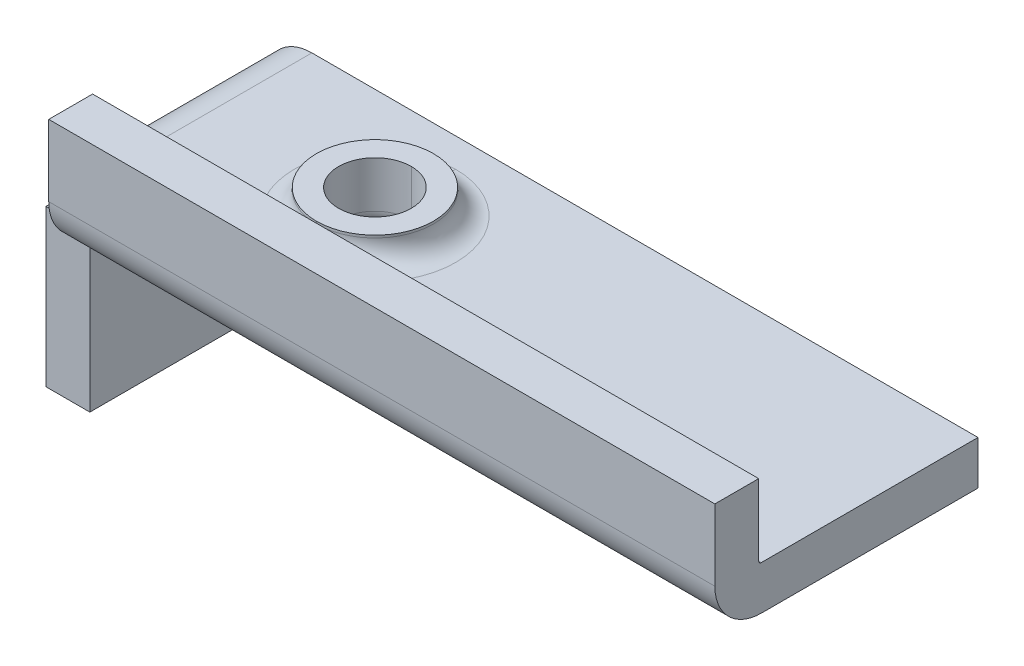
ISO-10303-21;
HEADER;
FILE_DESCRIPTION(('STEP AP214'),'2;1');
FILE_NAME('part.step','',(''),(''),'','','');
FILE_SCHEMA(('AUTOMOTIVE_DESIGN { 1 0 10303 214 1 1 1 1 }'));
ENDSEC;
DATA;
#1=APPLICATION_CONTEXT('core data for automotive mechanical design processes');
#2=APPLICATION_PROTOCOL_DEFINITION('international standard','automotive_design',2000,#1);
#3=PRODUCT_CONTEXT('',#1,'mechanical');
#4=PRODUCT('Part','Part','',(#3));
#5=PRODUCT_RELATED_PRODUCT_CATEGORY('part','',(#4));
#6=PRODUCT_DEFINITION_FORMATION('','',#4);
#7=PRODUCT_DEFINITION_CONTEXT('part definition',#1,'design');
#8=PRODUCT_DEFINITION('design','',#6,#7);
#9=PRODUCT_DEFINITION_SHAPE('','',#8);
#10=(LENGTH_UNIT() NAMED_UNIT(*) SI_UNIT(.MILLI.,.METRE.));
#11=(NAMED_UNIT(*) PLANE_ANGLE_UNIT() SI_UNIT($,.RADIAN.));
#12=(NAMED_UNIT(*) SI_UNIT($,.STERADIAN.) SOLID_ANGLE_UNIT());
#13=UNCERTAINTY_MEASURE_WITH_UNIT(LENGTH_MEASURE(1.E-05),#10,'distance_accuracy_value','');
#14=(GEOMETRIC_REPRESENTATION_CONTEXT(3) GLOBAL_UNCERTAINTY_ASSIGNED_CONTEXT((#13)) GLOBAL_UNIT_ASSIGNED_CONTEXT((#10,
#11,#12)) REPRESENTATION_CONTEXT('',''));
#15=CARTESIAN_POINT('',(0.,0.,0.));
#16=DIRECTION('',(0.,0.,1.));
#17=DIRECTION('',(1.,0.,0.));
#18=AXIS2_PLACEMENT_3D('',#15,#16,#17);
#19=CARTESIAN_POINT('',(-244.16652593928,215.2345812999,10.99999992174));
#20=DIRECTION('',(0.,1.,0.));
#21=DIRECTION('',(0.,0.,1.));
#22=AXIS2_PLACEMENT_3D('',#19,#20,#21);
#23=TOROIDAL_SURFACE('',#22,2.135,0.81);
#24=CARTESIAN_POINT('',(-244.16652593928,215.2345812999,10.99999992174));
#25=DIRECTION('',(0.,1.,0.));
#26=DIRECTION('',(0.,0.,1.));
#27=AXIS2_PLACEMENT_3D('',#24,#25,#26);
#28=CIRCLE('',#27,1.325);
#29=CARTESIAN_POINT('',(-244.16652593928,215.2345812999,12.32499992174));
#30=VERTEX_POINT('',#29);
#31=CARTESIAN_POINT('',(-244.16652593928,215.2345812999,9.67499992174));
#32=VERTEX_POINT('',#31);
#33=EDGE_CURVE('E11',#30,#32,#28,.T.);
#34=ORIENTED_EDGE('',*,*,#33,.T.);
#35=CARTESIAN_POINT('',(-244.16652593928,215.2345812999,8.86499992174));
#36=DIRECTION('',(1.,0.,0.));
#37=DIRECTION('',(0.,0.,1.));
#38=AXIS2_PLACEMENT_3D('',#35,#36,#37);
#39=CIRCLE('',#38,0.81);
#40=CARTESIAN_POINT('',(-244.16652593928,214.4245812999,8.86499992174));
#41=VERTEX_POINT('',#40);
#42=EDGE_CURVE('E416',#32,#41,#39,.T.);
#43=ORIENTED_EDGE('',*,*,#42,.T.);
#44=CARTESIAN_POINT('',(-244.16652593928,214.4245812999,10.99999992174));
#45=DIRECTION('',(0.,1.,0.));
#46=DIRECTION('',(0.,0.,1.));
#47=AXIS2_PLACEMENT_3D('',#44,#45,#46);
#48=CIRCLE('',#47,2.135);
#49=CARTESIAN_POINT('',(-244.16652593928,214.4245812999,13.13499992174));
#50=VERTEX_POINT('',#49);
#51=EDGE_CURVE('E405',#50,#41,#48,.T.);
#52=ORIENTED_EDGE('',*,*,#51,.F.);
#53=CARTESIAN_POINT('',(-244.16652593928,215.2345812999,13.13499992174));
#54=DIRECTION('',(-1.,0.,0.));
#55=DIRECTION('',(0.,0.,-1.));
#56=AXIS2_PLACEMENT_3D('',#53,#54,#55);
#57=CIRCLE('',#56,0.81);
#58=EDGE_CURVE('E413',#30,#50,#57,.T.);
#59=ORIENTED_EDGE('',*,*,#58,.F.);
#60=EDGE_LOOP('',(#34,#43,#52,#59));
#61=FACE_BOUND('',#60,.T.);
#62=ADVANCED_FACE('F16',(#61),#23,.T.);
#63=CARTESIAN_POINT('',(-244.16652593928,216.0795812999,10.99999992174));
#64=DIRECTION('',(0.,-1.,0.));
#65=DIRECTION('',(0.,0.,1.));
#66=AXIS2_PLACEMENT_3D('',#63,#64,#65);
#67=CYLINDRICAL_SURFACE('',#66,1.325);
#68=CARTESIAN_POINT('',(-244.16652593928,216.9245812999,10.99999992174));
#69=DIRECTION('',(0.,-1.,0.));
#70=DIRECTION('',(0.,0.,-1.));
#71=AXIS2_PLACEMENT_3D('',#68,#69,#70);
#72=CIRCLE('',#71,1.325);
#73=CARTESIAN_POINT('',(-244.16652593928,216.9245812999,9.67499992174));
#74=VERTEX_POINT('',#73);
#75=CARTESIAN_POINT('',(-244.16652593928,216.9245812999,12.32499992174));
#76=VERTEX_POINT('',#75);
#77=EDGE_CURVE('E163',#74,#76,#72,.T.);
#78=ORIENTED_EDGE('',*,*,#77,.F.);
#79=DIRECTION('',(0.,1.,0.));
#80=VECTOR('',#79,1.);
#81=CARTESIAN_POINT('',(-244.16652593928,215.2345812999,9.67499992174));
#82=LINE('',#81,#80);
#83=EDGE_CURVE('E174',#32,#74,#82,.T.);
#84=ORIENTED_EDGE('',*,*,#83,.F.);
#85=ORIENTED_EDGE('',*,*,#33,.F.);
#86=DIRECTION('',(0.,1.,0.));
#87=VECTOR('',#86,1.);
#88=CARTESIAN_POINT('',(-244.16652593928,215.2345812999,12.32499992174));
#89=LINE('',#88,#87);
#90=EDGE_CURVE('E423',#30,#76,#89,.T.);
#91=ORIENTED_EDGE('',*,*,#90,.T.);
#92=EDGE_LOOP('',(#78,#84,#85,#91));
#93=FACE_BOUND('',#92,.T.);
#94=ADVANCED_FACE('F438',(#93),#67,.F.);
#95=CARTESIAN_POINT('',(-244.16652593928,216.8795812999,10.99999992174));
#96=DIRECTION('',(0.,-1.,0.));
#97=DIRECTION('',(0.,0.,1.));
#98=AXIS2_PLACEMENT_3D('',#95,#96,#97);
#99=CYLINDRICAL_SURFACE('',#98,2.135);
#100=CARTESIAN_POINT('',(-244.16652593928,216.8345812999,10.99999992174));
#101=DIRECTION('',(0.,-1.,0.));
#102=DIRECTION('',(0.,0.,-1.));
#103=AXIS2_PLACEMENT_3D('',#100,#101,#102);
#104=CIRCLE('',#103,2.135);
#105=CARTESIAN_POINT('',(-244.16652593928,216.8345812999,8.86499992174));
#106=VERTEX_POINT('',#105);
#107=CARTESIAN_POINT('',(-244.16652593928,216.8345812999,13.13499992174));
#108=VERTEX_POINT('',#107);
#109=EDGE_CURVE('E26',#106,#108,#104,.T.);
#110=ORIENTED_EDGE('',*,*,#109,.F.);
#111=DIRECTION('',(0.,1.,0.));
#112=VECTOR('',#111,1.);
#113=CARTESIAN_POINT('',(-244.16652593928,216.8345812999,8.86499992174));
#114=LINE('',#113,#112);
#115=CARTESIAN_POINT('',(-244.16652593928,216.9245812999,8.86499992174));
#116=VERTEX_POINT('',#115);
#117=EDGE_CURVE('E147',#106,#116,#114,.T.);
#118=ORIENTED_EDGE('',*,*,#117,.T.);
#119=CARTESIAN_POINT('',(-244.16652593928,216.9245812999,10.99999992174));
#120=DIRECTION('',(0.,1.,0.));
#121=DIRECTION('',(0.,0.,1.));
#122=AXIS2_PLACEMENT_3D('',#119,#120,#121);
#123=CIRCLE('',#122,2.135);
#124=CARTESIAN_POINT('',(-244.16652593928,216.9245812999,13.13499992174));
#125=VERTEX_POINT('',#124);
#126=EDGE_CURVE('E151',#125,#116,#123,.T.);
#127=ORIENTED_EDGE('',*,*,#126,.F.);
#128=DIRECTION('',(0.,1.,0.));
#129=VECTOR('',#128,1.);
#130=CARTESIAN_POINT('',(-244.16652593928,216.8345812999,13.13499992174));
#131=LINE('',#130,#129);
#132=EDGE_CURVE('E156',#108,#125,#131,.T.);
#133=ORIENTED_EDGE('',*,*,#132,.F.);
#134=EDGE_LOOP('',(#110,#118,#127,#133));
#135=FACE_BOUND('',#134,.T.);
#136=ADVANCED_FACE('F149',(#135),#99,.T.);
#137=CARTESIAN_POINT('',(-244.16652593928,216.8345812999,10.99999992174));
#138=DIRECTION('',(0.,1.,0.));
#139=DIRECTION('',(0.,0.,1.));
#140=AXIS2_PLACEMENT_3D('',#137,#138,#139);
#141=TOROIDAL_SURFACE('',#140,2.945,0.81);
#142=CARTESIAN_POINT('',(-244.16652593928,216.0245812999,10.99999992174));
#143=DIRECTION('',(0.,-1.,0.));
#144=DIRECTION('',(0.,0.,-1.));
#145=AXIS2_PLACEMENT_3D('',#142,#143,#144);
#146=CIRCLE('',#145,2.945);
#147=CARTESIAN_POINT('',(-244.16652593928,216.0245812999,8.05499992174));
#148=VERTEX_POINT('',#147);
#149=CARTESIAN_POINT('',(-244.16652593928,216.0245812999,13.94499992174));
#150=VERTEX_POINT('',#149);
#151=EDGE_CURVE('E340',#148,#150,#146,.T.);
#152=ORIENTED_EDGE('',*,*,#151,.F.);
#153=CARTESIAN_POINT('',(-244.16652593928,216.8345812999,8.05499992174));
#154=DIRECTION('',(1.,0.,0.));
#155=DIRECTION('',(0.,0.,1.));
#156=AXIS2_PLACEMENT_3D('',#153,#154,#155);
#157=CIRCLE('',#156,0.81);
#158=EDGE_CURVE('E399',#106,#148,#157,.T.);
#159=ORIENTED_EDGE('',*,*,#158,.F.);
#160=ORIENTED_EDGE('',*,*,#109,.T.);
#161=CARTESIAN_POINT('',(-244.16652593928,216.8345812999,13.94499992174));
#162=DIRECTION('',(-1.,0.,0.));
#163=DIRECTION('',(0.,0.,-1.));
#164=AXIS2_PLACEMENT_3D('',#161,#162,#163);
#165=CIRCLE('',#164,0.81);
#166=EDGE_CURVE('E185',#108,#150,#165,.T.);
#167=ORIENTED_EDGE('',*,*,#166,.T.);
#168=EDGE_LOOP('',(#152,#159,#160,#167));
#169=FACE_BOUND('',#168,.T.);
#170=ADVANCED_FACE('F749',(#169),#141,.F.);
#171=CARTESIAN_POINT('',(-244.16652593928,216.8345812999,10.99999992174));
#172=DIRECTION('',(0.,1.,0.));
#173=DIRECTION('',(0.,0.,1.));
#174=AXIS2_PLACEMENT_3D('',#171,#172,#173);
#175=TOROIDAL_SURFACE('',#174,2.945,0.81);
#176=ORIENTED_EDGE('',*,*,#166,.F.);
#177=CARTESIAN_POINT('',(-244.16652593928,216.8345812999,10.99999992174));
#178=DIRECTION('',(0.,-1.,0.));
#179=DIRECTION('',(0.,0.,1.));
#180=AXIS2_PLACEMENT_3D('',#177,#178,#179);
#181=CIRCLE('',#180,2.135);
#182=EDGE_CURVE('E155',#108,#106,#181,.T.);
#183=ORIENTED_EDGE('',*,*,#182,.T.);
#184=ORIENTED_EDGE('',*,*,#158,.T.);
#185=CARTESIAN_POINT('',(-244.16652593928,216.0245812999,10.99999992174));
#186=DIRECTION('',(0.,-1.,0.));
#187=DIRECTION('',(0.,0.,1.));
#188=AXIS2_PLACEMENT_3D('',#185,#186,#187);
#189=CIRCLE('',#188,2.945);
#190=EDGE_CURVE('E344',#150,#148,#189,.T.);
#191=ORIENTED_EDGE('',*,*,#190,.F.);
#192=EDGE_LOOP('',(#176,#183,#184,#191));
#193=FACE_BOUND('',#192,.T.);
#194=ADVANCED_FACE('F449',(#193),#175,.F.);
#195=CARTESIAN_POINT('',(-244.16652593928,216.8795812999,10.99999992174));
#196=DIRECTION('',(0.,-1.,0.));
#197=DIRECTION('',(0.,0.,1.));
#198=AXIS2_PLACEMENT_3D('',#195,#196,#197);
#199=CYLINDRICAL_SURFACE('',#198,2.135);
#200=ORIENTED_EDGE('',*,*,#132,.T.);
#201=CARTESIAN_POINT('',(-244.16652593928,216.9245812999,10.99999992174));
#202=DIRECTION('',(0.,1.,0.));
#203=DIRECTION('',(0.,0.,-1.));
#204=AXIS2_PLACEMENT_3D('',#201,#202,#203);
#205=CIRCLE('',#204,2.135);
#206=EDGE_CURVE('E159',#116,#125,#205,.T.);
#207=ORIENTED_EDGE('',*,*,#206,.F.);
#208=ORIENTED_EDGE('',*,*,#117,.F.);
#209=ORIENTED_EDGE('',*,*,#182,.F.);
#210=EDGE_LOOP('',(#200,#207,#208,#209));
#211=FACE_BOUND('',#210,.T.);
#212=ADVANCED_FACE('F160',(#211),#199,.T.);
#213=CARTESIAN_POINT('',(-244.16652593928,216.9245812999,12.72999992174));
#214=DIRECTION('',(0.,-1.,0.));
#215=DIRECTION('',(1.,0.,0.));
#216=AXIS2_PLACEMENT_3D('',#213,#214,#215);
#217=PLANE('',#216);
#218=ORIENTED_EDGE('',*,*,#77,.T.);
#219=CARTESIAN_POINT('',(-244.16652593928,216.9245812999,10.99999992174));
#220=DIRECTION('',(0.,-1.,0.));
#221=DIRECTION('',(0.,0.,1.));
#222=AXIS2_PLACEMENT_3D('',#219,#220,#221);
#223=CIRCLE('',#222,1.325);
#224=EDGE_CURVE('E167',#76,#74,#223,.T.);
#225=ORIENTED_EDGE('',*,*,#224,.T.);
#226=EDGE_LOOP('',(#218,#225));
#227=FACE_BOUND('',#226,.T.);
#228=ORIENTED_EDGE('',*,*,#126,.T.);
#229=ORIENTED_EDGE('',*,*,#206,.T.);
#230=EDGE_LOOP('',(#228,#229));
#231=FACE_BOUND('',#230,.T.);
#232=ADVANCED_FACE('F165',(#227,#231),#217,.F.);
#233=CARTESIAN_POINT('',(-244.16652593928,216.0795812999,10.99999992174));
#234=DIRECTION('',(0.,-1.,0.));
#235=DIRECTION('',(0.,0.,1.));
#236=AXIS2_PLACEMENT_3D('',#233,#234,#235);
#237=CYLINDRICAL_SURFACE('',#236,1.325);
#238=ORIENTED_EDGE('',*,*,#90,.F.);
#239=CARTESIAN_POINT('',(-244.16652593928,215.2345812999,10.99999992174));
#240=DIRECTION('',(0.,1.,0.));
#241=DIRECTION('',(0.,0.,-1.));
#242=AXIS2_PLACEMENT_3D('',#239,#240,#241);
#243=CIRCLE('',#242,1.325);
#244=EDGE_CURVE('E419',#32,#30,#243,.T.);
#245=ORIENTED_EDGE('',*,*,#244,.F.);
#246=ORIENTED_EDGE('',*,*,#83,.T.);
#247=ORIENTED_EDGE('',*,*,#224,.F.);
#248=EDGE_LOOP('',(#238,#245,#246,#247));
#249=FACE_BOUND('',#248,.T.);
#250=ADVANCED_FACE('F435',(#249),#237,.F.);
#251=CARTESIAN_POINT('',(-244.16652593928,215.2345812999,10.99999992174));
#252=DIRECTION('',(0.,1.,0.));
#253=DIRECTION('',(0.,0.,1.));
#254=AXIS2_PLACEMENT_3D('',#251,#252,#253);
#255=TOROIDAL_SURFACE('',#254,2.135,0.81);
#256=ORIENTED_EDGE('',*,*,#58,.T.);
#257=CARTESIAN_POINT('',(-244.16652593928,214.4245812999,10.99999992174));
#258=DIRECTION('',(0.,1.,0.));
#259=DIRECTION('',(0.,0.,-1.));
#260=AXIS2_PLACEMENT_3D('',#257,#258,#259);
#261=CIRCLE('',#260,2.135);
#262=EDGE_CURVE('E409',#41,#50,#261,.T.);
#263=ORIENTED_EDGE('',*,*,#262,.F.);
#264=ORIENTED_EDGE('',*,*,#42,.F.);
#265=ORIENTED_EDGE('',*,*,#244,.T.);
#266=EDGE_LOOP('',(#256,#263,#264,#265));
#267=FACE_BOUND('',#266,.T.);
#268=ADVANCED_FACE('F447',(#267),#255,.T.);
#269=CARTESIAN_POINT('',(-250.46652593928,214.4245812999,14.99999992174));
#270=DIRECTION('',(0.,-1.,0.));
#271=DIRECTION('',(1.,0.,0.));
#272=AXIS2_PLACEMENT_3D('',#269,#270,#271);
#273=PLANE('',#272);
#274=ORIENTED_EDGE('',*,*,#51,.T.);
#275=ORIENTED_EDGE('',*,*,#262,.T.);
#276=EDGE_LOOP('',(#274,#275));
#277=FACE_BOUND('',#276,.T.);
#278=DIRECTION('',(0.,0.,1.));
#279=VECTOR('',#278,1.);
#280=CARTESIAN_POINT('',(-250.46652593928,214.4245812999,6.99999992174));
#281=LINE('',#280,#279);
#282=CARTESIAN_POINT('',(-250.46652593928,214.4245812999,6.99999992174));
#283=VERTEX_POINT('',#282);
#284=CARTESIAN_POINT('',(-250.46652593928,214.4245812999,14.89999992174));
#285=VERTEX_POINT('',#284);
#286=EDGE_CURVE('E469',#283,#285,#281,.T.);
#287=ORIENTED_EDGE('',*,*,#286,.F.);
#288=DIRECTION('',(1.,0.,0.));
#289=VECTOR('',#288,1.);
#290=CARTESIAN_POINT('',(-250.46652593928,214.4245812999,6.99999992174));
#291=LINE('',#290,#289);
#292=CARTESIAN_POINT('',(-226.16652593928,214.4245812999,6.99999992174));
#293=VERTEX_POINT('',#292);
#294=EDGE_CURVE('E326',#283,#293,#291,.T.);
#295=ORIENTED_EDGE('',*,*,#294,.T.);
#296=DIRECTION('',(0.,0.,-1.));
#297=VECTOR('',#296,1.);
#298=CARTESIAN_POINT('',(-226.16652593928,214.4245812999,14.89999992174));
#299=LINE('',#298,#297);
#300=CARTESIAN_POINT('',(-226.16652593928,214.4245812999,14.89999992174));
#301=VERTEX_POINT('',#300);
#302=EDGE_CURVE('E404',#301,#293,#299,.T.);
#303=ORIENTED_EDGE('',*,*,#302,.F.);
#304=DIRECTION('',(1.,0.,0.));
#305=VECTOR('',#304,1.);
#306=CARTESIAN_POINT('',(-250.46652593928,214.4245812999,14.89999992174));
#307=LINE('',#306,#305);
#308=EDGE_CURVE('E390',#285,#301,#307,.T.);
#309=ORIENTED_EDGE('',*,*,#308,.F.);
#310=EDGE_LOOP('',(#287,#295,#303,#309));
#311=FACE_BOUND('',#310,.T.);
#312=ADVANCED_FACE('F461',(#277,#311),#273,.T.);
#313=CARTESIAN_POINT('',(-226.16652593928,214.4245812999,14.99999992174));
#314=DIRECTION('',(1.,0.,0.));
#315=DIRECTION('',(0.,-1.,0.));
#316=AXIS2_PLACEMENT_3D('',#313,#314,#315);
#317=PLANE('',#316);
#318=DIRECTION('',(0.,-1.,0.));
#319=VECTOR('',#318,1.);
#320=CARTESIAN_POINT('',(-226.16652593928,216.0245812999,6.99999992174));
#321=LINE('',#320,#319);
#322=CARTESIAN_POINT('',(-226.16652593928,216.0245812999,6.99999992174));
#323=VERTEX_POINT('',#322);
#324=EDGE_CURVE('E322',#323,#293,#321,.T.);
#325=ORIENTED_EDGE('',*,*,#324,.F.);
#326=DIRECTION('',(0.,0.,-1.));
#327=VECTOR('',#326,1.);
#328=CARTESIAN_POINT('',(-226.16652593928,216.0245812999,14.89999992174));
#329=LINE('',#328,#327);
#330=CARTESIAN_POINT('',(-226.16652593928,216.0245812999,14.89999992174));
#331=VERTEX_POINT('',#330);
#332=EDGE_CURVE('E333',#331,#323,#329,.T.);
#333=ORIENTED_EDGE('',*,*,#332,.F.);
#334=CARTESIAN_POINT('',(-226.16652593928,216.1245812999,14.89999992174));
#335=DIRECTION('',(-1.,0.,0.));
#336=DIRECTION('',(0.,-1.,-7.460698725481E-13));
#337=AXIS2_PLACEMENT_3D('',#334,#335,#336);
#338=CIRCLE('',#337,0.1);
#339=CARTESIAN_POINT('',(-226.16652593928,216.1245812999,14.99999992174));
#340=VERTEX_POINT('',#339);
#341=EDGE_CURVE('E348',#331,#340,#338,.T.);
#342=ORIENTED_EDGE('',*,*,#341,.T.);
#343=DIRECTION('',(0.,-1.,0.));
#344=VECTOR('',#343,1.);
#345=CARTESIAN_POINT('',(-226.16652593928,218.7245812999,14.99999992174));
#346=LINE('',#345,#344);
#347=CARTESIAN_POINT('',(-226.16652593928,218.7245812999,14.99999992174));
#348=VERTEX_POINT('',#347);
#349=EDGE_CURVE('E359',#348,#340,#346,.T.);
#350=ORIENTED_EDGE('',*,*,#349,.F.);
#351=DIRECTION('',(0.,0.,1.));
#352=VECTOR('',#351,1.);
#353=CARTESIAN_POINT('',(-226.16652593928,218.7245812999,14.99999992174));
#354=LINE('',#353,#352);
#355=CARTESIAN_POINT('',(-226.16652593928,218.7245812999,16.59999992174));
#356=VERTEX_POINT('',#355);
#357=EDGE_CURVE('E370',#348,#356,#354,.T.);
#358=ORIENTED_EDGE('',*,*,#357,.T.);
#359=DIRECTION('',(0.,-1.,0.));
#360=VECTOR('',#359,1.);
#361=CARTESIAN_POINT('',(-226.16652593928,218.7245812999,16.59999992174));
#362=LINE('',#361,#360);
#363=CARTESIAN_POINT('',(-226.16652593928,216.1245812999,16.59999992174));
#364=VERTEX_POINT('',#363);
#365=EDGE_CURVE('E382',#356,#364,#362,.T.);
#366=ORIENTED_EDGE('',*,*,#365,.T.);
#367=CARTESIAN_POINT('',(-226.16652593928,216.1245812999,14.89999992174));
#368=DIRECTION('',(1.,0.,0.));
#369=DIRECTION('',(0.,-5.935121675173E-13,1.));
#370=AXIS2_PLACEMENT_3D('',#367,#368,#369);
#371=CIRCLE('',#370,1.7);
#372=EDGE_CURVE('E394',#364,#301,#371,.T.);
#373=ORIENTED_EDGE('',*,*,#372,.T.);
#374=ORIENTED_EDGE('',*,*,#302,.T.);
#375=EDGE_LOOP('',(#325,#333,#342,#350,#358,#366,#373,#374));
#376=FACE_BOUND('',#375,.T.);
#377=ADVANCED_FACE('F464',(#376),#317,.T.);
#378=CARTESIAN_POINT('',(-250.46652593928,216.1245812999,14.89999992174));
#379=DIRECTION('',(1.,0.,0.));
#380=DIRECTION('',(0.,-1.,0.));
#381=AXIS2_PLACEMENT_3D('',#378,#379,#380);
#382=PLANE('',#381);
#383=DIRECTION('',(0.,1.,0.));
#384=VECTOR('',#383,1.);
#385=CARTESIAN_POINT('',(-250.46652593928,216.1245812999,16.59999992174));
#386=LINE('',#385,#384);
#387=CARTESIAN_POINT('',(-250.46652593928,216.1245812999,16.59999992174));
#388=VERTEX_POINT('',#387);
#389=CARTESIAN_POINT('',(-250.46652593928,218.7245812999,16.59999992174));
#390=VERTEX_POINT('',#389);
#391=EDGE_CURVE('E383',#388,#390,#386,.T.);
#392=ORIENTED_EDGE('',*,*,#391,.T.);
#393=DIRECTION('',(0.,0.,1.));
#394=VECTOR('',#393,1.);
#395=CARTESIAN_POINT('',(-250.46652593928,218.7245812999,14.99999992174));
#396=LINE('',#395,#394);
#397=CARTESIAN_POINT('',(-250.46652593928,218.7245812999,14.99999992174));
#398=VERTEX_POINT('',#397);
#399=EDGE_CURVE('E374',#398,#390,#396,.T.);
#400=ORIENTED_EDGE('',*,*,#399,.F.);
#401=DIRECTION('',(0.,1.,0.));
#402=VECTOR('',#401,1.);
#403=CARTESIAN_POINT('',(-250.46652593928,216.1245812999,14.99999992174));
#404=LINE('',#403,#402);
#405=CARTESIAN_POINT('',(-250.46652593928,216.1245812999,14.99999992174));
#406=VERTEX_POINT('',#405);
#407=EDGE_CURVE('E362',#406,#398,#404,.T.);
#408=ORIENTED_EDGE('',*,*,#407,.F.);
#409=CARTESIAN_POINT('',(-250.46652593928,216.1245812999,14.89999992174));
#410=DIRECTION('',(1.,0.,0.));
#411=DIRECTION('',(0.,-1.136868377216E-12,1.));
#412=AXIS2_PLACEMENT_3D('',#409,#410,#411);
#413=CIRCLE('',#412,0.1);
#414=CARTESIAN_POINT('',(-250.46652593928,216.0245812999,14.89999992174));
#415=VERTEX_POINT('',#414);
#416=EDGE_CURVE('E352',#406,#415,#413,.T.);
#417=ORIENTED_EDGE('',*,*,#416,.T.);
#418=DIRECTION('',(0.,-1.,0.));
#419=VECTOR('',#418,1.);
#420=CARTESIAN_POINT('',(-250.46652593928,216.0245812999,14.89999992174));
#421=LINE('',#420,#419);
#422=EDGE_CURVE('E497',#415,#285,#421,.T.);
#423=ORIENTED_EDGE('',*,*,#422,.T.);
#424=CARTESIAN_POINT('',(-250.46652593928,216.1245812999,14.89999992174));
#425=DIRECTION('',(-1.,0.,0.));
#426=DIRECTION('',(0.,-1.,0.));
#427=AXIS2_PLACEMENT_3D('',#424,#425,#426);
#428=CIRCLE('',#427,1.7);
#429=EDGE_CURVE('E398',#285,#388,#428,.T.);
#430=ORIENTED_EDGE('',*,*,#429,.T.);
#431=EDGE_LOOP('',(#392,#400,#408,#417,#423,#430));
#432=FACE_BOUND('',#431,.T.);
#433=ADVANCED_FACE('F601',(#432),#382,.F.);
#434=CARTESIAN_POINT('',(-228.16652593928,216.1245812999,14.89999992174));
#435=DIRECTION('',(1.,0.,0.));
#436=DIRECTION('',(0.,-1.,0.));
#437=AXIS2_PLACEMENT_3D('',#434,#435,#436);
#438=CYLINDRICAL_SURFACE('',#437,1.7);
#439=ORIENTED_EDGE('',*,*,#308,.T.);
#440=ORIENTED_EDGE('',*,*,#372,.F.);
#441=DIRECTION('',(-1.,0.,0.));
#442=VECTOR('',#441,1.);
#443=CARTESIAN_POINT('',(-226.16652593928,216.1245812999,16.59999992174));
#444=LINE('',#443,#442);
#445=EDGE_CURVE('E386',#364,#388,#444,.T.);
#446=ORIENTED_EDGE('',*,*,#445,.T.);
#447=ORIENTED_EDGE('',*,*,#429,.F.);
#448=EDGE_LOOP('',(#439,#440,#446,#447));
#449=FACE_BOUND('',#448,.T.);
#450=ADVANCED_FACE('F597',(#449),#438,.T.);
#451=CARTESIAN_POINT('',(-250.46652593928,215.8790060993,16.59999992174));
#452=DIRECTION('',(0.,0.,1.));
#453=DIRECTION('',(0.,1.,0.));
#454=AXIS2_PLACEMENT_3D('',#451,#452,#453);
#455=PLANE('',#454);
#456=ORIENTED_EDGE('',*,*,#365,.F.);
#457=DIRECTION('',(-1.,0.,0.));
#458=VECTOR('',#457,1.);
#459=CARTESIAN_POINT('',(-226.16652593928,218.7245812999,16.59999992174));
#460=LINE('',#459,#458);
#461=EDGE_CURVE('E378',#356,#390,#460,.T.);
#462=ORIENTED_EDGE('',*,*,#461,.T.);
#463=ORIENTED_EDGE('',*,*,#391,.F.);
#464=ORIENTED_EDGE('',*,*,#445,.F.);
#465=EDGE_LOOP('',(#456,#462,#463,#464));
#466=FACE_BOUND('',#465,.T.);
#467=ADVANCED_FACE('F593',(#466),#455,.T.);
#468=CARTESIAN_POINT('',(-228.16652593928,218.7245812999,16.59999992174));
#469=DIRECTION('',(0.,1.,0.));
#470=DIRECTION('',(0.,0.,1.));
#471=AXIS2_PLACEMENT_3D('',#468,#469,#470);
#472=PLANE('',#471);
#473=ORIENTED_EDGE('',*,*,#357,.F.);
#474=DIRECTION('',(-1.,0.,0.));
#475=VECTOR('',#474,1.);
#476=CARTESIAN_POINT('',(-226.16652593928,218.7245812999,14.99999992174));
#477=LINE('',#476,#475);
#478=EDGE_CURVE('E366',#348,#398,#477,.T.);
#479=ORIENTED_EDGE('',*,*,#478,.T.);
#480=ORIENTED_EDGE('',*,*,#399,.T.);
#481=ORIENTED_EDGE('',*,*,#461,.F.);
#482=EDGE_LOOP('',(#473,#479,#480,#481));
#483=FACE_BOUND('',#482,.T.);
#484=ADVANCED_FACE('F579',(#483),#472,.T.);
#485=CARTESIAN_POINT('',(-250.46652593928,215.8790060993,14.99999992174));
#486=DIRECTION('',(0.,0.,1.));
#487=DIRECTION('',(0.,1.,0.));
#488=AXIS2_PLACEMENT_3D('',#485,#486,#487);
#489=PLANE('',#488);
#490=ORIENTED_EDGE('',*,*,#349,.T.);
#491=DIRECTION('',(1.,0.,0.));
#492=VECTOR('',#491,1.);
#493=CARTESIAN_POINT('',(-250.46652593928,216.1245812999,14.99999992174));
#494=LINE('',#493,#492);
#495=EDGE_CURVE('E355',#406,#340,#494,.T.);
#496=ORIENTED_EDGE('',*,*,#495,.F.);
#497=ORIENTED_EDGE('',*,*,#407,.T.);
#498=ORIENTED_EDGE('',*,*,#478,.F.);
#499=EDGE_LOOP('',(#490,#496,#497,#498));
#500=FACE_BOUND('',#499,.T.);
#501=ADVANCED_FACE('F577',(#500),#489,.F.);
#502=CARTESIAN_POINT('',(-228.16652593928,216.1245812999,14.89999992174));
#503=DIRECTION('',(1.,0.,0.));
#504=DIRECTION('',(0.,-1.,0.));
#505=AXIS2_PLACEMENT_3D('',#502,#503,#504);
#506=CYLINDRICAL_SURFACE('',#505,0.1);
#507=ORIENTED_EDGE('',*,*,#341,.F.);
#508=DIRECTION('',(-1.,0.,0.));
#509=VECTOR('',#508,1.);
#510=CARTESIAN_POINT('',(-226.16652593928,216.0245812999,14.89999992174));
#511=LINE('',#510,#509);
#512=EDGE_CURVE('E336',#331,#415,#511,.T.);
#513=ORIENTED_EDGE('',*,*,#512,.T.);
#514=ORIENTED_EDGE('',*,*,#416,.F.);
#515=ORIENTED_EDGE('',*,*,#495,.T.);
#516=EDGE_LOOP('',(#507,#513,#514,#515));
#517=FACE_BOUND('',#516,.T.);
#518=ADVANCED_FACE('F575',(#517),#506,.F.);
#519=CARTESIAN_POINT('',(-250.46652593928,216.0245812999,14.99999992174));
#520=DIRECTION('',(0.,-1.,0.));
#521=DIRECTION('',(1.,0.,0.));
#522=AXIS2_PLACEMENT_3D('',#519,#520,#521);
#523=PLANE('',#522);
#524=ORIENTED_EDGE('',*,*,#151,.T.);
#525=ORIENTED_EDGE('',*,*,#190,.T.);
#526=EDGE_LOOP('',(#524,#525));
#527=FACE_BOUND('',#526,.T.);
#528=ORIENTED_EDGE('',*,*,#332,.T.);
#529=DIRECTION('',(-1.,0.,0.));
#530=VECTOR('',#529,1.);
#531=CARTESIAN_POINT('',(-226.16652593928,216.0245812999,6.99999992174));
#532=LINE('',#531,#530);
#533=CARTESIAN_POINT('',(-250.46652593928,216.0245812999,6.99999992174));
#534=VERTEX_POINT('',#533);
#535=EDGE_CURVE('E330',#323,#534,#532,.T.);
#536=ORIENTED_EDGE('',*,*,#535,.T.);
#537=DIRECTION('',(0.,0.,-1.));
#538=VECTOR('',#537,1.);
#539=CARTESIAN_POINT('',(-250.46652593928,216.0245812999,14.89999992174));
#540=LINE('',#539,#538);
#541=EDGE_CURVE('E302',#415,#534,#540,.T.);
#542=ORIENTED_EDGE('',*,*,#541,.F.);
#543=ORIENTED_EDGE('',*,*,#512,.F.);
#544=EDGE_LOOP('',(#528,#536,#542,#543));
#545=FACE_BOUND('',#544,.T.);
#546=ADVANCED_FACE('F587',(#527,#545),#523,.F.);
#547=CARTESIAN_POINT('',(-256.77210353988,212.6245812999,6.99999992174));
#548=DIRECTION('',(0.,0.,1.));
#549=DIRECTION('',(0.,1.,0.));
#550=AXIS2_PLACEMENT_3D('',#547,#548,#549);
#551=PLANE('',#550);
#552=ORIENTED_EDGE('',*,*,#324,.T.);
#553=ORIENTED_EDGE('',*,*,#294,.F.);
#554=CARTESIAN_POINT('',(-250.46652593928,214.3245812999,6.99999992174));
#555=DIRECTION('',(0.,0.,1.));
#556=DIRECTION('',(7.105427357601E-13,1.,0.));
#557=AXIS2_PLACEMENT_3D('',#554,#555,#556);
#558=CIRCLE('',#557,0.1);
#559=CARTESIAN_POINT('',(-250.56652593928,214.3245812999,6.99999992174));
#560=VERTEX_POINT('',#559);
#561=EDGE_CURVE('E475',#283,#560,#558,.T.);
#562=ORIENTED_EDGE('',*,*,#561,.T.);
#563=DIRECTION('',(0.,1.,0.));
#564=VECTOR('',#563,1.);
#565=CARTESIAN_POINT('',(-250.56652593928,208.62458129992,6.99999992174));
#566=LINE('',#565,#564);
#567=CARTESIAN_POINT('',(-250.56652593928,208.62458129992,6.99999992174));
#568=VERTEX_POINT('',#567);
#569=EDGE_CURVE('E489',#568,#560,#566,.T.);
#570=ORIENTED_EDGE('',*,*,#569,.F.);
#571=DIRECTION('',(1.,0.,0.));
#572=VECTOR('',#571,1.);
#573=CARTESIAN_POINT('',(-252.16652593928,208.62458129992,6.99999992174));
#574=LINE('',#573,#572);
#575=CARTESIAN_POINT('',(-252.16652593928,208.62458129992,6.99999992174));
#576=VERTEX_POINT('',#575);
#577=EDGE_CURVE('E319',#576,#568,#574,.T.);
#578=ORIENTED_EDGE('',*,*,#577,.F.);
#579=DIRECTION('',(0.,-1.,0.));
#580=VECTOR('',#579,1.);
#581=CARTESIAN_POINT('',(-252.16652593928,214.3245812999,6.99999992174));
#582=LINE('',#581,#580);
#583=CARTESIAN_POINT('',(-252.16652593928,214.3245812999,6.99999992174));
#584=VERTEX_POINT('',#583);
#585=EDGE_CURVE('E273',#584,#576,#582,.T.);
#586=ORIENTED_EDGE('',*,*,#585,.F.);
#587=CARTESIAN_POINT('',(-250.46652593928,214.3245812999,6.99999992174));
#588=DIRECTION('',(0.,0.,-1.));
#589=DIRECTION('',(-1.,0.,0.));
#590=AXIS2_PLACEMENT_3D('',#587,#588,#589);
#591=CIRCLE('',#590,1.7);
#592=EDGE_CURVE('E296',#584,#534,#591,.T.);
#593=ORIENTED_EDGE('',*,*,#592,.T.);
#594=ORIENTED_EDGE('',*,*,#535,.F.);
#595=EDGE_LOOP('',(#552,#553,#562,#570,#578,#586,#593,#594));
#596=FACE_BOUND('',#595,.T.);
#597=ADVANCED_FACE('F584',(#596),#551,.F.);
#598=CARTESIAN_POINT('',(-251.28096956382,208.62458129992,10.275290952503));
#599=DIRECTION('',(0.,-1.,0.));
#600=DIRECTION('',(1.,0.,0.));
#601=AXIS2_PLACEMENT_3D('',#598,#599,#600);
#602=PLANE('',#601);
#603=DIRECTION('',(-1.,0.,0.));
#604=VECTOR('',#603,1.);
#605=CARTESIAN_POINT('',(-250.56652593928,208.62458129992,14.99999992174));
#606=LINE('',#605,#604);
#607=CARTESIAN_POINT('',(-250.56652593928,208.62458129992,14.99999992174));
#608=VERTEX_POINT('',#607);
#609=CARTESIAN_POINT('',(-252.16652593928,208.62458129992,14.99999992174));
#610=VERTEX_POINT('',#609);
#611=EDGE_CURVE('E555',#608,#610,#606,.T.);
#612=ORIENTED_EDGE('',*,*,#611,.T.);
#613=DIRECTION('',(0.,0.,-1.));
#614=VECTOR('',#613,1.);
#615=CARTESIAN_POINT('',(-252.16652593928,208.62458129992,14.99999992174));
#616=LINE('',#615,#614);
#617=EDGE_CURVE('E281',#610,#576,#616,.T.);
#618=ORIENTED_EDGE('',*,*,#617,.T.);
#619=ORIENTED_EDGE('',*,*,#577,.T.);
#620=DIRECTION('',(0.,0.,1.));
#621=VECTOR('',#620,1.);
#622=CARTESIAN_POINT('',(-250.56652593928,208.62458129992,6.99999992174));
#623=LINE('',#622,#621);
#624=EDGE_CURVE('E492',#568,#608,#623,.T.);
#625=ORIENTED_EDGE('',*,*,#624,.T.);
#626=EDGE_LOOP('',(#612,#618,#619,#625));
#627=FACE_BOUND('',#626,.T.);
#628=ADVANCED_FACE('F208',(#627),#602,.T.);
#629=CARTESIAN_POINT('',(-252.16652593928,209.42458129992,8.99999992174));
#630=DIRECTION('',(-1.,0.,0.));
#631=DIRECTION('',(0.,0.,-1.));
#632=AXIS2_PLACEMENT_3D('',#629,#630,#631);
#633=PLANE('',#632);
#634=ORIENTED_EDGE('',*,*,#585,.T.);
#635=ORIENTED_EDGE('',*,*,#617,.F.);
#636=DIRECTION('',(0.,-1.,0.));
#637=VECTOR('',#636,1.);
#638=CARTESIAN_POINT('',(-252.16652593928,214.3245812999,14.99999992174));
#639=LINE('',#638,#637);
#640=CARTESIAN_POINT('',(-252.16652593928,214.3245812999,14.99999992174));
#641=VERTEX_POINT('',#640);
#642=EDGE_CURVE('E516',#641,#610,#639,.T.);
#643=ORIENTED_EDGE('',*,*,#642,.F.);
#644=DIRECTION('',(-1.42108547152E-13,-1.42108547152E-13,1.));
#645=VECTOR('',#644,1.);
#646=CARTESIAN_POINT('',(-252.16652593928,214.3245812999,14.89999992174));
#647=LINE('',#646,#645);
#648=CARTESIAN_POINT('',(-252.16652593928,214.3245812999,14.89999992174));
#649=VERTEX_POINT('',#648);
#650=EDGE_CURVE('E512',#649,#641,#647,.T.);
#651=ORIENTED_EDGE('',*,*,#650,.F.);
#652=DIRECTION('',(0.,0.,1.));
#653=VECTOR('',#652,1.);
#654=CARTESIAN_POINT('',(-252.16652593928,214.3245812999,12.74999992174));
#655=LINE('',#654,#653);
#656=CARTESIAN_POINT('',(-252.16652593928,214.3245812999,12.74999992174));
#657=VERTEX_POINT('',#656);
#658=EDGE_CURVE('E271',#657,#649,#655,.T.);
#659=ORIENTED_EDGE('',*,*,#658,.F.);
#660=CARTESIAN_POINT('',(-252.16652593928,214.3245812999,12.74999992174));
#661=DIRECTION('',(0.,1.,0.));
#662=VECTOR('',#661,1.);
#663=LINE('',#660,#662);
#664=CARTESIAN_POINT('',(-252.16505409404,214.4245807115,12.74999992174));
#665=VERTEX_POINT('',#664);
#666=EDGE_CURVE('E190',#657,#665,#663,.T.);
#667=ORIENTED_EDGE('',*,*,#666,.T.);
#668=CARTESIAN_POINT('',(-252.163587335035,214.424494357301,9.24999992174));
#669=DIRECTION('',(0.,0.,1.));
#670=VECTOR('',#669,1.);
#671=LINE('',#668,#670);
#672=CARTESIAN_POINT('',(-252.16505409404,214.4245807115,9.24999992174));
#673=VERTEX_POINT('',#672);
#674=EDGE_CURVE('E269',#673,#665,#671,.T.);
#675=ORIENTED_EDGE('',*,*,#674,.F.);
#676=CARTESIAN_POINT('',(-252.16652593928,214.4245807115,9.24999992174));
#677=DIRECTION('',(0.,-1.,0.));
#678=VECTOR('',#677,1.);
#679=LINE('',#676,#678);
#680=CARTESIAN_POINT('',(-252.16652593928,214.3245812999,9.24999992174));
#681=VERTEX_POINT('',#680);
#682=EDGE_CURVE('E230',#673,#681,#679,.T.);
#683=ORIENTED_EDGE('',*,*,#682,.T.);
#684=DIRECTION('',(0.,0.,1.));
#685=VECTOR('',#684,1.);
#686=CARTESIAN_POINT('',(-252.16652593928,214.3245812999,6.99999992174));
#687=LINE('',#686,#685);
#688=EDGE_CURVE('E244',#584,#681,#687,.T.);
#689=ORIENTED_EDGE('',*,*,#688,.F.);
#690=EDGE_LOOP('',(#634,#635,#643,#651,#659,#667,#675,#683,#689));
#691=FACE_BOUND('',#690,.T.);
#692=ADVANCED_FACE('F197',(#691),#633,.T.);
#693=CARTESIAN_POINT('',(-250.46652593928,214.3245812999,6.99999992174));
#694=DIRECTION('',(0.,0.,-1.));
#695=DIRECTION('',(1.,0.,0.));
#696=AXIS2_PLACEMENT_3D('',#693,#694,#695);
#697=CYLINDRICAL_SURFACE('',#696,1.7);
#698=ORIENTED_EDGE('',*,*,#541,.T.);
#699=ORIENTED_EDGE('',*,*,#592,.F.);
#700=ORIENTED_EDGE('',*,*,#688,.T.);
#701=ORIENTED_EDGE('',*,*,#682,.F.);
#702=ORIENTED_EDGE('',*,*,#674,.T.);
#703=ORIENTED_EDGE('',*,*,#666,.F.);
#704=ORIENTED_EDGE('',*,*,#658,.T.);
#705=CARTESIAN_POINT('',(-250.46652593928,214.3245812999,14.89999992174));
#706=DIRECTION('',(0.,0.,1.));
#707=DIRECTION('',(0.,1.,0.));
#708=AXIS2_PLACEMENT_3D('',#705,#706,#707);
#709=CIRCLE('',#708,1.7);
#710=EDGE_CURVE('E311',#415,#649,#709,.T.);
#711=ORIENTED_EDGE('',*,*,#710,.F.);
#712=EDGE_LOOP('',(#698,#699,#700,#701,#702,#703,#704,#711));
#713=FACE_BOUND('',#712,.T.);
#714=ADVANCED_FACE('F207',(#713),#697,.T.);
#715=CARTESIAN_POINT('',(-250.46652593928,214.3245812999,14.89999992174));
#716=DIRECTION('',(0.,0.,1.));
#717=DIRECTION('',(0.,1.,0.));
#718=AXIS2_PLACEMENT_3D('',#715,#716,#717);
#719=PLANE('',#718);
#720=ORIENTED_EDGE('',*,*,#422,.F.);
#721=ORIENTED_EDGE('',*,*,#710,.T.);
#722=DIRECTION('',(1.,0.,0.));
#723=VECTOR('',#722,1.);
#724=CARTESIAN_POINT('',(-252.16652593928,214.3245812999,14.89999992174));
#725=LINE('',#724,#723);
#726=CARTESIAN_POINT('',(-250.56652593928,214.3245812999,14.89999992174));
#727=VERTEX_POINT('',#726);
#728=EDGE_CURVE('E509',#649,#727,#725,.T.);
#729=ORIENTED_EDGE('',*,*,#728,.T.);
#730=CARTESIAN_POINT('',(-250.46652593928,214.3245812999,14.89999992174));
#731=DIRECTION('',(0.,0.,-1.));
#732=DIRECTION('',(-1.,0.,0.));
#733=AXIS2_PLACEMENT_3D('',#730,#731,#732);
#734=CIRCLE('',#733,0.1);
#735=EDGE_CURVE('E474',#727,#285,#734,.T.);
#736=ORIENTED_EDGE('',*,*,#735,.T.);
#737=EDGE_LOOP('',(#720,#721,#729,#736));
#738=FACE_BOUND('',#737,.T.);
#739=ADVANCED_FACE('F253',(#738),#719,.T.);
#740=CARTESIAN_POINT('',(-250.46652593928,214.3245812999,6.99999992174));
#741=DIRECTION('',(0.,0.,-1.));
#742=DIRECTION('',(1.,0.,0.));
#743=AXIS2_PLACEMENT_3D('',#740,#741,#742);
#744=CYLINDRICAL_SURFACE('',#743,0.1);
#745=DIRECTION('',(0.,0.,-1.));
#746=VECTOR('',#745,1.);
#747=CARTESIAN_POINT('',(-250.56652593928,214.3245812999,14.89999992174));
#748=LINE('',#747,#746);
#749=EDGE_CURVE('E480',#727,#560,#748,.T.);
#750=ORIENTED_EDGE('',*,*,#749,.T.);
#751=ORIENTED_EDGE('',*,*,#561,.F.);
#752=ORIENTED_EDGE('',*,*,#286,.T.);
#753=ORIENTED_EDGE('',*,*,#735,.F.);
#754=EDGE_LOOP('',(#750,#751,#752,#753));
#755=FACE_BOUND('',#754,.T.);
#756=ADVANCED_FACE('F478',(#755),#744,.F.);
#757=CARTESIAN_POINT('',(-250.56652593928,209.42458129992,12.99999992174));
#758=DIRECTION('',(1.,0.,0.));
#759=DIRECTION('',(0.,-1.,0.));
#760=AXIS2_PLACEMENT_3D('',#757,#758,#759);
#761=PLANE('',#760);
#762=DIRECTION('',(0.,1.,0.));
#763=VECTOR('',#762,1.);
#764=CARTESIAN_POINT('',(-250.56652593928,208.62458129992,14.99999992174));
#765=LINE('',#764,#763);
#766=CARTESIAN_POINT('',(-250.56652593928,214.3245812999,14.99999992174));
#767=VERTEX_POINT('',#766);
#768=EDGE_CURVE('E530',#608,#767,#765,.T.);
#769=ORIENTED_EDGE('',*,*,#768,.F.);
#770=ORIENTED_EDGE('',*,*,#624,.F.);
#771=ORIENTED_EDGE('',*,*,#569,.T.);
#772=ORIENTED_EDGE('',*,*,#749,.F.);
#773=DIRECTION('',(0.,1.42108547152E-13,-1.));
#774=VECTOR('',#773,1.);
#775=CARTESIAN_POINT('',(-250.56652593928,214.3245812999,14.99999992174));
#776=LINE('',#775,#774);
#777=EDGE_CURVE('E521',#767,#727,#776,.T.);
#778=ORIENTED_EDGE('',*,*,#777,.F.);
#779=EDGE_LOOP('',(#769,#770,#771,#772,#778));
#780=FACE_BOUND('',#779,.T.);
#781=ADVANCED_FACE('F211',(#780),#761,.T.);
#782=CARTESIAN_POINT('',(-250.56652593928,214.3245812999,14.89999992174));
#783=DIRECTION('',(0.,1.,0.));
#784=DIRECTION('',(0.,0.,1.));
#785=AXIS2_PLACEMENT_3D('',#782,#783,#784);
#786=PLANE('',#785);
#787=ORIENTED_EDGE('',*,*,#728,.F.);
#788=ORIENTED_EDGE('',*,*,#650,.T.);
#789=DIRECTION('',(1.,0.,0.));
#790=VECTOR('',#789,1.);
#791=CARTESIAN_POINT('',(-252.16652593928,214.3245812999,14.99999992174));
#792=LINE('',#791,#790);
#793=EDGE_CURVE('E525',#641,#767,#792,.T.);
#794=ORIENTED_EDGE('',*,*,#793,.T.);
#795=ORIENTED_EDGE('',*,*,#777,.T.);
#796=EDGE_LOOP('',(#787,#788,#794,#795));
#797=FACE_BOUND('',#796,.T.);
#798=ADVANCED_FACE('F209',(#797),#786,.T.);
#799=CARTESIAN_POINT('',(-93.03864029087,348.3544725907,14.99999992174));
#800=DIRECTION('',(0.,0.,1.));
#801=DIRECTION('',(0.,1.,0.));
#802=AXIS2_PLACEMENT_3D('',#799,#800,#801);
#803=PLANE('',#802);
#804=ORIENTED_EDGE('',*,*,#642,.T.);
#805=ORIENTED_EDGE('',*,*,#611,.F.);
#806=ORIENTED_EDGE('',*,*,#768,.T.);
#807=ORIENTED_EDGE('',*,*,#793,.F.);
#808=EDGE_LOOP('',(#804,#805,#806,#807));
#809=FACE_BOUND('',#808,.T.);
#810=ADVANCED_FACE('F254',(#809),#803,.T.);
#811=CLOSED_SHELL('',(#62,#94,#136,#170,#194,#212,#232,#250,#268,#312,#377,#433,#450,#467,#484,
#501,#518,#546,#597,#628,#692,#714,#739,#756,#781,#798,#810));
#812=MANIFOLD_SOLID_BREP('B1',#811);
#813=ADVANCED_BREP_SHAPE_REPRESENTATION('',(#18,#812),#14);
#814=SHAPE_DEFINITION_REPRESENTATION(#9,#813);
ENDSEC;
END-ISO-10303-21;
